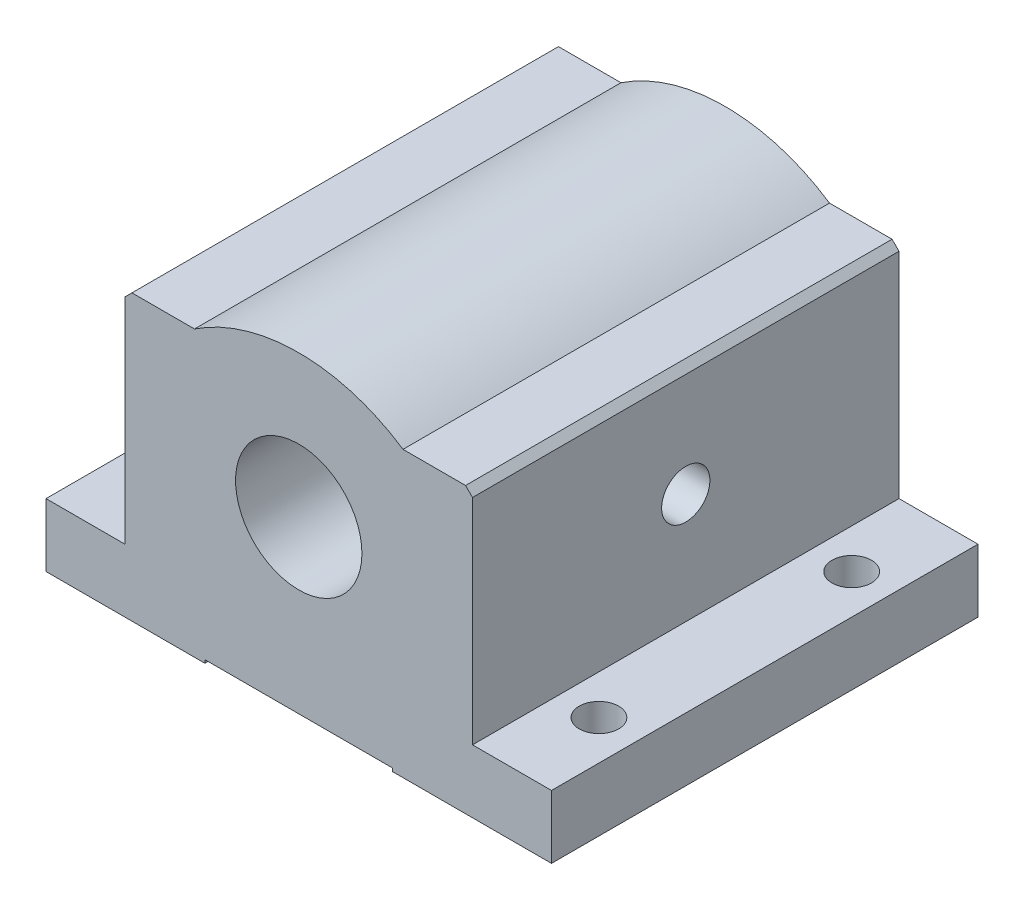
ISO-10303-21;
HEADER;
FILE_DESCRIPTION(('STEP AP214'),'2;1');
FILE_NAME('part.step','',(''),(''),'','','');
FILE_SCHEMA(('AUTOMOTIVE_DESIGN { 1 0 10303 214 1 1 1 1 }'));
ENDSEC;
DATA;
#1=APPLICATION_CONTEXT('core data for automotive mechanical design processes');
#2=APPLICATION_PROTOCOL_DEFINITION('international standard','automotive_design',2000,#1);
#3=PRODUCT_CONTEXT('',#1,'mechanical');
#4=PRODUCT('Part','Part','',(#3));
#5=PRODUCT_RELATED_PRODUCT_CATEGORY('part','',(#4));
#6=PRODUCT_DEFINITION_FORMATION('','',#4);
#7=PRODUCT_DEFINITION_CONTEXT('part definition',#1,'design');
#8=PRODUCT_DEFINITION('design','',#6,#7);
#9=PRODUCT_DEFINITION_SHAPE('','',#8);
#10=(LENGTH_UNIT() NAMED_UNIT(*) SI_UNIT(.MILLI.,.METRE.));
#11=(NAMED_UNIT(*) PLANE_ANGLE_UNIT() SI_UNIT($,.RADIAN.));
#12=(NAMED_UNIT(*) SI_UNIT($,.STERADIAN.) SOLID_ANGLE_UNIT());
#13=UNCERTAINTY_MEASURE_WITH_UNIT(LENGTH_MEASURE(1.E-05),#10,'distance_accuracy_value','');
#14=(GEOMETRIC_REPRESENTATION_CONTEXT(3) GLOBAL_UNCERTAINTY_ASSIGNED_CONTEXT((#13)) GLOBAL_UNIT_ASSIGNED_CONTEXT((#10,
#11,#12)) REPRESENTATION_CONTEXT('',''));
#15=CARTESIAN_POINT('',(0.,0.,0.));
#16=DIRECTION('',(0.,0.,1.));
#17=DIRECTION('',(1.,0.,0.));
#18=AXIS2_PLACEMENT_3D('',#15,#16,#17);
#19=CARTESIAN_POINT('',(0.,-3.000375,21.43125));
#20=DIRECTION('',(0.,0.,-1.));
#21=DIRECTION('',(-1.,0.,0.));
#22=AXIS2_PLACEMENT_3D('',#19,#20,#21);
#23=PLANE('',#22);
#24=DIRECTION('',(-1.,0.,0.));
#25=VECTOR('',#24,1.);
#26=CARTESIAN_POINT('',(-17.4625,12.7,21.43125));
#27=LINE('',#26,#25);
#28=CARTESIAN_POINT('',(-10.4775,12.7,21.43125));
#29=VERTEX_POINT('',#28);
#30=CARTESIAN_POINT('',(-16.764,12.7,21.43125));
#31=VERTEX_POINT('',#30);
#32=EDGE_CURVE('E290',#29,#31,#27,.T.);
#33=ORIENTED_EDGE('',*,*,#32,.T.);
#34=DIRECTION('',(0.707106781186548,0.707106781186548,0.));
#35=VECTOR('',#34,1.);
#36=CARTESIAN_POINT('',(-17.4625,12.0015,21.43125));
#37=LINE('',#36,#35);
#38=CARTESIAN_POINT('',(-17.4625,12.0015,21.43125));
#39=VERTEX_POINT('',#38);
#40=EDGE_CURVE('E192',#31,#39,#37,.F.);
#41=ORIENTED_EDGE('',*,*,#40,.T.);
#42=DIRECTION('',(0.,-1.,0.));
#43=VECTOR('',#42,1.);
#44=CARTESIAN_POINT('',(-17.4625,-9.525,21.43125));
#45=LINE('',#44,#43);
#46=CARTESIAN_POINT('',(-17.4625,-9.525,21.43125));
#47=VERTEX_POINT('',#46);
#48=EDGE_CURVE('E292',#39,#47,#45,.T.);
#49=ORIENTED_EDGE('',*,*,#48,.T.);
#50=DIRECTION('',(-1.,0.,0.));
#51=VECTOR('',#50,1.);
#52=CARTESIAN_POINT('',(-25.4,-9.525,21.43125));
#53=LINE('',#52,#51);
#54=CARTESIAN_POINT('',(-25.4,-9.525,21.43125));
#55=VERTEX_POINT('',#54);
#56=EDGE_CURVE('E168',#47,#55,#53,.T.);
#57=ORIENTED_EDGE('',*,*,#56,.T.);
#58=DIRECTION('',(0.,-1.,0.));
#59=VECTOR('',#58,1.);
#60=CARTESIAN_POINT('',(-25.4,-9.525,21.43125));
#61=LINE('',#60,#59);
#62=CARTESIAN_POINT('',(-25.4,-15.875,21.43125));
#63=VERTEX_POINT('',#62);
#64=EDGE_CURVE('E162',#55,#63,#61,.T.);
#65=ORIENTED_EDGE('',*,*,#64,.T.);
#66=DIRECTION('',(1.,0.,0.));
#67=VECTOR('',#66,1.);
#68=CARTESIAN_POINT('',(-25.4,-15.875,21.43125));
#69=LINE('',#68,#67);
#70=CARTESIAN_POINT('',(-9.42975,-15.875,21.43125));
#71=VERTEX_POINT('',#70);
#72=EDGE_CURVE('E152',#63,#71,#69,.T.);
#73=ORIENTED_EDGE('',*,*,#72,.T.);
#74=DIRECTION('',(0.,1.,0.));
#75=VECTOR('',#74,1.);
#76=CARTESIAN_POINT('',(-9.42975,-15.875,21.43125));
#77=LINE('',#76,#75);
#78=CARTESIAN_POINT('',(-9.42975,-15.5575,21.43125));
#79=VERTEX_POINT('',#78);
#80=EDGE_CURVE('E161',#71,#79,#77,.T.);
#81=ORIENTED_EDGE('',*,*,#80,.T.);
#82=DIRECTION('',(1.,0.,0.));
#83=VECTOR('',#82,1.);
#84=CARTESIAN_POINT('',(-9.42975,-15.5575,21.43125));
#85=LINE('',#84,#83);
#86=CARTESIAN_POINT('',(9.42975,-15.5575,21.43125));
#87=VERTEX_POINT('',#86);
#88=EDGE_CURVE('E256',#79,#87,#85,.T.);
#89=ORIENTED_EDGE('',*,*,#88,.T.);
#90=DIRECTION('',(0.,-1.,0.));
#91=VECTOR('',#90,1.);
#92=CARTESIAN_POINT('',(9.42975,-15.5575,21.43125));
#93=LINE('',#92,#91);
#94=CARTESIAN_POINT('',(9.42975,-15.875,21.43125));
#95=VERTEX_POINT('',#94);
#96=EDGE_CURVE('E298',#87,#95,#93,.T.);
#97=ORIENTED_EDGE('',*,*,#96,.T.);
#98=DIRECTION('',(1.,0.,0.));
#99=VECTOR('',#98,1.);
#100=CARTESIAN_POINT('',(9.42975,-15.875,21.43125));
#101=LINE('',#100,#99);
#102=CARTESIAN_POINT('',(25.4,-15.875,21.43125));
#103=VERTEX_POINT('',#102);
#104=EDGE_CURVE('E302',#95,#103,#101,.T.);
#105=ORIENTED_EDGE('',*,*,#104,.T.);
#106=DIRECTION('',(0.,1.,0.));
#107=VECTOR('',#106,1.);
#108=CARTESIAN_POINT('',(25.4,-9.525,21.43125));
#109=LINE('',#108,#107);
#110=CARTESIAN_POINT('',(25.4,-9.525,21.43125));
#111=VERTEX_POINT('',#110);
#112=EDGE_CURVE('E285',#103,#111,#109,.T.);
#113=ORIENTED_EDGE('',*,*,#112,.T.);
#114=DIRECTION('',(-1.,0.,0.));
#115=VECTOR('',#114,1.);
#116=CARTESIAN_POINT('',(17.4625,-9.525,21.43125));
#117=LINE('',#116,#115);
#118=CARTESIAN_POINT('',(17.4625,-9.525,21.43125));
#119=VERTEX_POINT('',#118);
#120=EDGE_CURVE('E281',#111,#119,#117,.T.);
#121=ORIENTED_EDGE('',*,*,#120,.T.);
#122=DIRECTION('',(0.,1.,0.));
#123=VECTOR('',#122,1.);
#124=CARTESIAN_POINT('',(17.4625,12.7,21.43125));
#125=LINE('',#124,#123);
#126=CARTESIAN_POINT('',(17.4625,12.0015,21.43125));
#127=VERTEX_POINT('',#126);
#128=EDGE_CURVE('E280',#119,#127,#125,.T.);
#129=ORIENTED_EDGE('',*,*,#128,.T.);
#130=DIRECTION('',(0.707106781186544,-0.707106781186551,0.));
#131=VECTOR('',#130,1.);
#132=CARTESIAN_POINT('',(16.764,12.7,21.43125));
#133=LINE('',#132,#131);
#134=CARTESIAN_POINT('',(16.764,12.7,21.43125));
#135=VERTEX_POINT('',#134);
#136=EDGE_CURVE('E54',#127,#135,#133,.F.);
#137=ORIENTED_EDGE('',*,*,#136,.T.);
#138=DIRECTION('',(-1.,0.,0.));
#139=VECTOR('',#138,1.);
#140=CARTESIAN_POINT('',(10.4775,12.7,21.43125));
#141=LINE('',#140,#139);
#142=CARTESIAN_POINT('',(10.4775,12.7,21.43125));
#143=VERTEX_POINT('',#142);
#144=EDGE_CURVE('E201',#135,#143,#141,.T.);
#145=ORIENTED_EDGE('',*,*,#144,.T.);
#146=CARTESIAN_POINT('',(0.,-3.000375,21.43125));
#147=DIRECTION('',(0.,0.,1.));
#148=DIRECTION('',(-1.,0.,0.));
#149=AXIS2_PLACEMENT_3D('',#146,#147,#148);
#150=CIRCLE('',#149,18.875375);
#151=EDGE_CURVE('E283',#143,#29,#150,.T.);
#152=ORIENTED_EDGE('',*,*,#151,.T.);
#153=EDGE_LOOP('',(#33,#41,#49,#57,#65,#73,#81,#89,#97,#105,#113,#121,#129,#137,#145,#152));
#154=FACE_BOUND('',#153,.T.);
#155=CARTESIAN_POINT('',(0.,1.5748,21.43125));
#156=DIRECTION('',(0.,0.,1.));
#157=DIRECTION('',(1.,0.,0.));
#158=AXIS2_PLACEMENT_3D('',#155,#156,#157);
#159=CIRCLE('',#158,6.35);
#160=CARTESIAN_POINT('',(6.35,1.5748,21.43125));
#161=VERTEX_POINT('',#160);
#162=EDGE_CURVE('E295',#161,#161,#159,.T.);
#163=ORIENTED_EDGE('',*,*,#162,.F.);
#164=EDGE_LOOP('',(#163));
#165=FACE_BOUND('',#164,.T.);
#166=ADVANCED_FACE('F39',(#154,#165),#23,.F.);
#167=CARTESIAN_POINT('',(0.,-3.000375,-21.43125));
#168=DIRECTION('',(0.,0.,-1.));
#169=DIRECTION('',(-1.,0.,0.));
#170=AXIS2_PLACEMENT_3D('',#167,#168,#169);
#171=PLANE('',#170);
#172=DIRECTION('',(0.,-1.,0.));
#173=VECTOR('',#172,1.);
#174=CARTESIAN_POINT('',(-17.4625,-9.525,-21.43125));
#175=LINE('',#174,#173);
#176=CARTESIAN_POINT('',(-17.4625,12.0015,-21.43125));
#177=VERTEX_POINT('',#176);
#178=CARTESIAN_POINT('',(-17.4625,-9.525,-21.43125));
#179=VERTEX_POINT('',#178);
#180=EDGE_CURVE('E221',#177,#179,#175,.T.);
#181=ORIENTED_EDGE('',*,*,#180,.F.);
#182=DIRECTION('',(-0.707106781186548,-0.707106781186548,0.));
#183=VECTOR('',#182,1.);
#184=CARTESIAN_POINT('',(-16.2321875,13.2318125,-21.43125));
#185=LINE('',#184,#183);
#186=CARTESIAN_POINT('',(-16.764,12.7,-21.43125));
#187=VERTEX_POINT('',#186);
#188=EDGE_CURVE('E187',#177,#187,#185,.F.);
#189=ORIENTED_EDGE('',*,*,#188,.T.);
#190=DIRECTION('',(-1.,0.,0.));
#191=VECTOR('',#190,1.);
#192=CARTESIAN_POINT('',(-17.4625,12.7,-21.43125));
#193=LINE('',#192,#191);
#194=CARTESIAN_POINT('',(-10.4775,12.7,-21.43125));
#195=VERTEX_POINT('',#194);
#196=EDGE_CURVE('E213',#195,#187,#193,.T.);
#197=ORIENTED_EDGE('',*,*,#196,.F.);
#198=CARTESIAN_POINT('',(0.,-3.000375,-21.43125));
#199=DIRECTION('',(0.,0.,1.));
#200=DIRECTION('',(-1.,0.,0.));
#201=AXIS2_PLACEMENT_3D('',#198,#199,#200);
#202=CIRCLE('',#201,18.875375);
#203=CARTESIAN_POINT('',(10.4775,12.7,-21.43125));
#204=VERTEX_POINT('',#203);
#205=EDGE_CURVE('E210',#204,#195,#202,.T.);
#206=ORIENTED_EDGE('',*,*,#205,.F.);
#207=DIRECTION('',(-1.,0.,0.));
#208=VECTOR('',#207,1.);
#209=CARTESIAN_POINT('',(10.4775,12.7,-21.43125));
#210=LINE('',#209,#208);
#211=CARTESIAN_POINT('',(16.764,12.7,-21.43125));
#212=VERTEX_POINT('',#211);
#213=EDGE_CURVE('E199',#212,#204,#210,.T.);
#214=ORIENTED_EDGE('',*,*,#213,.F.);
#215=DIRECTION('',(-0.707106781186544,0.707106781186551,0.));
#216=VECTOR('',#215,1.);
#217=CARTESIAN_POINT('',(16.2321875000001,13.2318124999999,-21.43125));
#218=LINE('',#217,#216);
#219=CARTESIAN_POINT('',(17.4625,12.0015,-21.43125));
#220=VERTEX_POINT('',#219);
#221=EDGE_CURVE('E180',#212,#220,#218,.F.);
#222=ORIENTED_EDGE('',*,*,#221,.T.);
#223=DIRECTION('',(0.,1.,0.));
#224=VECTOR('',#223,1.);
#225=CARTESIAN_POINT('',(17.4625,12.7,-21.43125));
#226=LINE('',#225,#224);
#227=CARTESIAN_POINT('',(17.4625,-9.525,-21.43125));
#228=VERTEX_POINT('',#227);
#229=EDGE_CURVE('E211',#228,#220,#226,.T.);
#230=ORIENTED_EDGE('',*,*,#229,.F.);
#231=DIRECTION('',(-1.,0.,0.));
#232=VECTOR('',#231,1.);
#233=CARTESIAN_POINT('',(17.4625,-9.525,-21.43125));
#234=LINE('',#233,#232);
#235=CARTESIAN_POINT('',(25.4,-9.525,-21.43125));
#236=VERTEX_POINT('',#235);
#237=EDGE_CURVE('E215',#236,#228,#234,.T.);
#238=ORIENTED_EDGE('',*,*,#237,.F.);
#239=DIRECTION('',(0.,1.,0.));
#240=VECTOR('',#239,1.);
#241=CARTESIAN_POINT('',(25.4,-9.525,-21.43125));
#242=LINE('',#241,#240);
#243=CARTESIAN_POINT('',(25.4,-15.875,-21.43125));
#244=VERTEX_POINT('',#243);
#245=EDGE_CURVE('E271',#244,#236,#242,.T.);
#246=ORIENTED_EDGE('',*,*,#245,.F.);
#247=DIRECTION('',(1.,0.,0.));
#248=VECTOR('',#247,1.);
#249=CARTESIAN_POINT('',(9.42975,-15.875,-21.43125));
#250=LINE('',#249,#248);
#251=CARTESIAN_POINT('',(9.42975,-15.875,-21.43125));
#252=VERTEX_POINT('',#251);
#253=EDGE_CURVE('E264',#252,#244,#250,.T.);
#254=ORIENTED_EDGE('',*,*,#253,.F.);
#255=DIRECTION('',(0.,-1.,0.));
#256=VECTOR('',#255,1.);
#257=CARTESIAN_POINT('',(9.42975,-15.5575,-21.43125));
#258=LINE('',#257,#256);
#259=CARTESIAN_POINT('',(9.42975,-15.5575,-21.43125));
#260=VERTEX_POINT('',#259);
#261=EDGE_CURVE('E262',#260,#252,#258,.T.);
#262=ORIENTED_EDGE('',*,*,#261,.F.);
#263=DIRECTION('',(1.,0.,0.));
#264=VECTOR('',#263,1.);
#265=CARTESIAN_POINT('',(-9.42975,-15.5575,-21.43125));
#266=LINE('',#265,#264);
#267=CARTESIAN_POINT('',(-9.42975,-15.5575,-21.43125));
#268=VERTEX_POINT('',#267);
#269=EDGE_CURVE('E255',#268,#260,#266,.T.);
#270=ORIENTED_EDGE('',*,*,#269,.F.);
#271=DIRECTION('',(0.,1.,0.));
#272=VECTOR('',#271,1.);
#273=CARTESIAN_POINT('',(-9.42975,-15.875,-21.43125));
#274=LINE('',#273,#272);
#275=CARTESIAN_POINT('',(-9.42975,-15.875,-21.43125));
#276=VERTEX_POINT('',#275);
#277=EDGE_CURVE('E260',#276,#268,#274,.T.);
#278=ORIENTED_EDGE('',*,*,#277,.F.);
#279=DIRECTION('',(1.,0.,0.));
#280=VECTOR('',#279,1.);
#281=CARTESIAN_POINT('',(-25.4,-15.875,-21.43125));
#282=LINE('',#281,#280);
#283=CARTESIAN_POINT('',(-25.4,-15.875,-21.43125));
#284=VERTEX_POINT('',#283);
#285=EDGE_CURVE('E266',#284,#276,#282,.T.);
#286=ORIENTED_EDGE('',*,*,#285,.F.);
#287=DIRECTION('',(0.,-1.,0.));
#288=VECTOR('',#287,1.);
#289=CARTESIAN_POINT('',(-25.4,-9.525,-21.43125));
#290=LINE('',#289,#288);
#291=CARTESIAN_POINT('',(-25.4,-9.525,-21.43125));
#292=VERTEX_POINT('',#291);
#293=EDGE_CURVE('E176',#292,#284,#290,.T.);
#294=ORIENTED_EDGE('',*,*,#293,.F.);
#295=DIRECTION('',(-1.,0.,0.));
#296=VECTOR('',#295,1.);
#297=CARTESIAN_POINT('',(-25.4,-9.525,-21.43125));
#298=LINE('',#297,#296);
#299=EDGE_CURVE('E172',#179,#292,#298,.T.);
#300=ORIENTED_EDGE('',*,*,#299,.F.);
#301=EDGE_LOOP('',(#181,#189,#197,#206,#214,#222,#230,#238,#246,#254,#262,#270,#278,#286,#294,#300));
#302=FACE_BOUND('',#301,.T.);
#303=CARTESIAN_POINT('',(0.,1.5748,-21.43125));
#304=DIRECTION('',(0.,0.,1.));
#305=DIRECTION('',(1.,0.,0.));
#306=AXIS2_PLACEMENT_3D('',#303,#304,#305);
#307=CIRCLE('',#306,6.35);
#308=CARTESIAN_POINT('',(6.35,1.5748,-21.43125));
#309=VERTEX_POINT('',#308);
#310=EDGE_CURVE('E539',#309,#309,#307,.T.);
#311=ORIENTED_EDGE('',*,*,#310,.T.);
#312=EDGE_LOOP('',(#311));
#313=FACE_BOUND('',#312,.T.);
#314=ADVANCED_FACE('F206',(#302,#313),#171,.T.);
#315=CARTESIAN_POINT('',(-25.4,-9.525,21.43125));
#316=DIRECTION('',(1.,0.,0.));
#317=DIRECTION('',(0.,1.,0.));
#318=AXIS2_PLACEMENT_3D('',#315,#316,#317);
#319=PLANE('',#318);
#320=ORIENTED_EDGE('',*,*,#293,.T.);
#321=DIRECTION('',(0.,0.,-1.));
#322=VECTOR('',#321,1.);
#323=CARTESIAN_POINT('',(-25.4,-15.875,21.43125));
#324=LINE('',#323,#322);
#325=EDGE_CURVE('E156',#63,#284,#324,.T.);
#326=ORIENTED_EDGE('',*,*,#325,.F.);
#327=ORIENTED_EDGE('',*,*,#64,.F.);
#328=DIRECTION('',(0.,0.,-1.));
#329=VECTOR('',#328,1.);
#330=CARTESIAN_POINT('',(-25.4,-9.525,21.43125));
#331=LINE('',#330,#329);
#332=EDGE_CURVE('E224',#55,#292,#331,.T.);
#333=ORIENTED_EDGE('',*,*,#332,.T.);
#334=EDGE_LOOP('',(#320,#326,#327,#333));
#335=FACE_BOUND('',#334,.T.);
#336=ADVANCED_FACE('F174',(#335),#319,.F.);
#337=CARTESIAN_POINT('',(-25.4,-15.875,21.43125));
#338=DIRECTION('',(0.,1.,0.));
#339=DIRECTION('',(0.,0.,1.));
#340=AXIS2_PLACEMENT_3D('',#337,#338,#339);
#341=PLANE('',#340);
#342=CARTESIAN_POINT('',(-21.4376,-15.875,12.7));
#343=DIRECTION('',(0.,1.,0.));
#344=DIRECTION('',(-1.,0.,0.));
#345=AXIS2_PLACEMENT_3D('',#342,#343,#344);
#346=CIRCLE('',#345,1.984375);
#347=CARTESIAN_POINT('',(-23.421975,-15.875,12.7));
#348=VERTEX_POINT('',#347);
#349=EDGE_CURVE('E553',#348,#348,#346,.T.);
#350=ORIENTED_EDGE('',*,*,#349,.T.);
#351=EDGE_LOOP('',(#350));
#352=FACE_BOUND('',#351,.T.);
#353=CARTESIAN_POINT('',(-21.4376,-15.875,-12.7));
#354=DIRECTION('',(0.,1.,0.));
#355=DIRECTION('',(-1.,0.,0.));
#356=AXIS2_PLACEMENT_3D('',#353,#354,#355);
#357=CIRCLE('',#356,1.984375);
#358=CARTESIAN_POINT('',(-23.421975,-15.875,-12.7));
#359=VERTEX_POINT('',#358);
#360=EDGE_CURVE('E540',#359,#359,#357,.T.);
#361=ORIENTED_EDGE('',*,*,#360,.T.);
#362=EDGE_LOOP('',(#361));
#363=FACE_BOUND('',#362,.T.);
#364=ORIENTED_EDGE('',*,*,#285,.T.);
#365=DIRECTION('',(0.,0.,-1.));
#366=VECTOR('',#365,1.);
#367=CARTESIAN_POINT('',(-9.42975,-15.875,21.43125));
#368=LINE('',#367,#366);
#369=EDGE_CURVE('E159',#71,#276,#368,.T.);
#370=ORIENTED_EDGE('',*,*,#369,.F.);
#371=ORIENTED_EDGE('',*,*,#72,.F.);
#372=ORIENTED_EDGE('',*,*,#325,.T.);
#373=EDGE_LOOP('',(#364,#370,#371,#372));
#374=FACE_BOUND('',#373,.T.);
#375=ADVANCED_FACE('F154',(#352,#363,#374),#341,.F.);
#376=CARTESIAN_POINT('',(-9.42975,-15.875,21.43125));
#377=DIRECTION('',(-1.,0.,0.));
#378=DIRECTION('',(0.,-1.,0.));
#379=AXIS2_PLACEMENT_3D('',#376,#377,#378);
#380=PLANE('',#379);
#381=ORIENTED_EDGE('',*,*,#277,.T.);
#382=DIRECTION('',(0.,0.,-1.));
#383=VECTOR('',#382,1.);
#384=CARTESIAN_POINT('',(-9.42975,-15.5575,21.43125));
#385=LINE('',#384,#383);
#386=EDGE_CURVE('E182',#79,#268,#385,.T.);
#387=ORIENTED_EDGE('',*,*,#386,.F.);
#388=ORIENTED_EDGE('',*,*,#80,.F.);
#389=ORIENTED_EDGE('',*,*,#369,.T.);
#390=EDGE_LOOP('',(#381,#387,#388,#389));
#391=FACE_BOUND('',#390,.T.);
#392=ADVANCED_FACE('F296',(#391),#380,.F.);
#393=CARTESIAN_POINT('',(-9.42975,-15.5575,21.43125));
#394=DIRECTION('',(0.,1.,0.));
#395=DIRECTION('',(0.,0.,1.));
#396=AXIS2_PLACEMENT_3D('',#393,#394,#395);
#397=PLANE('',#396);
#398=ORIENTED_EDGE('',*,*,#269,.T.);
#399=DIRECTION('',(0.,0.,-1.));
#400=VECTOR('',#399,1.);
#401=CARTESIAN_POINT('',(9.42975,-15.5575,21.43125));
#402=LINE('',#401,#400);
#403=EDGE_CURVE('E246',#87,#260,#402,.T.);
#404=ORIENTED_EDGE('',*,*,#403,.F.);
#405=ORIENTED_EDGE('',*,*,#88,.F.);
#406=ORIENTED_EDGE('',*,*,#386,.T.);
#407=EDGE_LOOP('',(#398,#404,#405,#406));
#408=FACE_BOUND('',#407,.T.);
#409=ADVANCED_FACE('F253',(#408),#397,.F.);
#410=CARTESIAN_POINT('',(9.42975,-15.5575,21.43125));
#411=DIRECTION('',(1.,0.,0.));
#412=DIRECTION('',(0.,1.,0.));
#413=AXIS2_PLACEMENT_3D('',#410,#411,#412);
#414=PLANE('',#413);
#415=ORIENTED_EDGE('',*,*,#261,.T.);
#416=DIRECTION('',(0.,0.,-1.));
#417=VECTOR('',#416,1.);
#418=CARTESIAN_POINT('',(9.42975,-15.875,21.43125));
#419=LINE('',#418,#417);
#420=EDGE_CURVE('E243',#95,#252,#419,.T.);
#421=ORIENTED_EDGE('',*,*,#420,.F.);
#422=ORIENTED_EDGE('',*,*,#96,.F.);
#423=ORIENTED_EDGE('',*,*,#403,.T.);
#424=EDGE_LOOP('',(#415,#421,#422,#423));
#425=FACE_BOUND('',#424,.T.);
#426=ADVANCED_FACE('F313',(#425),#414,.F.);
#427=CARTESIAN_POINT('',(9.42975,-15.875,21.43125));
#428=DIRECTION('',(0.,1.,0.));
#429=DIRECTION('',(0.,0.,1.));
#430=AXIS2_PLACEMENT_3D('',#427,#428,#429);
#431=PLANE('',#430);
#432=CARTESIAN_POINT('',(21.4376,-15.875,12.7));
#433=DIRECTION('',(0.,1.,0.));
#434=DIRECTION('',(-1.,0.,0.));
#435=AXIS2_PLACEMENT_3D('',#432,#433,#434);
#436=CIRCLE('',#435,1.984375);
#437=CARTESIAN_POINT('',(19.453225,-15.875,12.7));
#438=VERTEX_POINT('',#437);
#439=EDGE_CURVE('E560',#438,#438,#436,.T.);
#440=ORIENTED_EDGE('',*,*,#439,.T.);
#441=EDGE_LOOP('',(#440));
#442=FACE_BOUND('',#441,.T.);
#443=CARTESIAN_POINT('',(21.4376,-15.875,-12.7));
#444=DIRECTION('',(0.,1.,0.));
#445=DIRECTION('',(-1.,0.,0.));
#446=AXIS2_PLACEMENT_3D('',#443,#444,#445);
#447=CIRCLE('',#446,1.984375);
#448=CARTESIAN_POINT('',(19.453225,-15.875,-12.7));
#449=VERTEX_POINT('',#448);
#450=EDGE_CURVE('E548',#449,#449,#447,.T.);
#451=ORIENTED_EDGE('',*,*,#450,.T.);
#452=EDGE_LOOP('',(#451));
#453=FACE_BOUND('',#452,.T.);
#454=ORIENTED_EDGE('',*,*,#253,.T.);
#455=DIRECTION('',(0.,0.,-1.));
#456=VECTOR('',#455,1.);
#457=CARTESIAN_POINT('',(25.4,-15.875,21.43125));
#458=LINE('',#457,#456);
#459=EDGE_CURVE('E240',#103,#244,#458,.T.);
#460=ORIENTED_EDGE('',*,*,#459,.F.);
#461=ORIENTED_EDGE('',*,*,#104,.F.);
#462=ORIENTED_EDGE('',*,*,#420,.T.);
#463=EDGE_LOOP('',(#454,#460,#461,#462));
#464=FACE_BOUND('',#463,.T.);
#465=ADVANCED_FACE('F309',(#442,#453,#464),#431,.F.);
#466=CARTESIAN_POINT('',(25.4,-9.525,21.43125));
#467=DIRECTION('',(-1.,0.,0.));
#468=DIRECTION('',(0.,-1.,0.));
#469=AXIS2_PLACEMENT_3D('',#466,#467,#468);
#470=PLANE('',#469);
#471=ORIENTED_EDGE('',*,*,#245,.T.);
#472=DIRECTION('',(0.,0.,-1.));
#473=VECTOR('',#472,1.);
#474=CARTESIAN_POINT('',(25.4,-9.525,21.43125));
#475=LINE('',#474,#473);
#476=EDGE_CURVE('E237',#111,#236,#475,.T.);
#477=ORIENTED_EDGE('',*,*,#476,.F.);
#478=ORIENTED_EDGE('',*,*,#112,.F.);
#479=ORIENTED_EDGE('',*,*,#459,.T.);
#480=EDGE_LOOP('',(#471,#477,#478,#479));
#481=FACE_BOUND('',#480,.T.);
#482=ADVANCED_FACE('F307',(#481),#470,.F.);
#483=CARTESIAN_POINT('',(17.4625,-9.525,21.43125));
#484=DIRECTION('',(0.,-1.,0.));
#485=DIRECTION('',(0.,0.,-1.));
#486=AXIS2_PLACEMENT_3D('',#483,#484,#485);
#487=PLANE('',#486);
#488=CARTESIAN_POINT('',(21.4376,-9.52499999999999,12.7));
#489=DIRECTION('',(0.,1.,0.));
#490=DIRECTION('',(-1.,0.,0.));
#491=AXIS2_PLACEMENT_3D('',#488,#489,#490);
#492=CIRCLE('',#491,1.984375);
#493=CARTESIAN_POINT('',(19.453225,-9.52499999999999,12.7));
#494=VERTEX_POINT('',#493);
#495=EDGE_CURVE('E557',#494,#494,#492,.T.);
#496=ORIENTED_EDGE('',*,*,#495,.F.);
#497=EDGE_LOOP('',(#496));
#498=FACE_BOUND('',#497,.T.);
#499=CARTESIAN_POINT('',(21.4376,-9.52499999999999,-12.7));
#500=DIRECTION('',(0.,1.,0.));
#501=DIRECTION('',(-1.,0.,0.));
#502=AXIS2_PLACEMENT_3D('',#499,#500,#501);
#503=CIRCLE('',#502,1.984375);
#504=CARTESIAN_POINT('',(19.453225,-9.52499999999999,-12.7));
#505=VERTEX_POINT('',#504);
#506=EDGE_CURVE('E563',#505,#505,#503,.T.);
#507=ORIENTED_EDGE('',*,*,#506,.F.);
#508=EDGE_LOOP('',(#507));
#509=FACE_BOUND('',#508,.T.);
#510=ORIENTED_EDGE('',*,*,#237,.T.);
#511=DIRECTION('',(0.,0.,-1.));
#512=VECTOR('',#511,1.);
#513=CARTESIAN_POINT('',(17.4625,-9.525,21.43125));
#514=LINE('',#513,#512);
#515=EDGE_CURVE('E234',#119,#228,#514,.T.);
#516=ORIENTED_EDGE('',*,*,#515,.F.);
#517=ORIENTED_EDGE('',*,*,#120,.F.);
#518=ORIENTED_EDGE('',*,*,#476,.T.);
#519=EDGE_LOOP('',(#510,#516,#517,#518));
#520=FACE_BOUND('',#519,.T.);
#521=ADVANCED_FACE('F275',(#498,#509,#520),#487,.F.);
#522=CARTESIAN_POINT('',(17.4625,12.7,21.43125));
#523=DIRECTION('',(-1.,0.,0.));
#524=DIRECTION('',(0.,0.,1.));
#525=AXIS2_PLACEMENT_3D('',#522,#523,#524);
#526=PLANE('',#525);
#527=CARTESIAN_POINT('',(17.4625,1.5748,0.));
#528=DIRECTION('',(1.,0.,0.));
#529=DIRECTION('',(0.,0.,-1.));
#530=AXIS2_PLACEMENT_3D('',#527,#528,#529);
#531=CIRCLE('',#530,2.4257);
#532=CARTESIAN_POINT('',(17.4625,1.5748,-2.4257));
#533=VERTEX_POINT('',#532);
#534=EDGE_CURVE('E554',#533,#533,#531,.T.);
#535=ORIENTED_EDGE('',*,*,#534,.F.);
#536=EDGE_LOOP('',(#535));
#537=FACE_BOUND('',#536,.T.);
#538=ORIENTED_EDGE('',*,*,#229,.T.);
#539=DIRECTION('',(0.,0.,1.));
#540=VECTOR('',#539,1.);
#541=CARTESIAN_POINT('',(17.4625,12.0015,21.43125));
#542=LINE('',#541,#540);
#543=EDGE_CURVE('E11',#220,#127,#542,.T.);
#544=ORIENTED_EDGE('',*,*,#543,.T.);
#545=ORIENTED_EDGE('',*,*,#128,.F.);
#546=ORIENTED_EDGE('',*,*,#515,.T.);
#547=EDGE_LOOP('',(#538,#544,#545,#546));
#548=FACE_BOUND('',#547,.T.);
#549=ADVANCED_FACE('F279',(#537,#548),#526,.F.);
#550=CARTESIAN_POINT('',(10.4775,12.7,21.43125));
#551=DIRECTION('',(0.,-1.,0.));
#552=DIRECTION('',(1.,0.,0.));
#553=AXIS2_PLACEMENT_3D('',#550,#551,#552);
#554=PLANE('',#553);
#555=ORIENTED_EDGE('',*,*,#144,.F.);
#556=DIRECTION('',(0.,0.,-1.));
#557=VECTOR('',#556,1.);
#558=CARTESIAN_POINT('',(16.764,12.7,21.43125));
#559=LINE('',#558,#557);
#560=EDGE_CURVE('E47',#135,#212,#559,.T.);
#561=ORIENTED_EDGE('',*,*,#560,.T.);
#562=ORIENTED_EDGE('',*,*,#213,.T.);
#563=DIRECTION('',(0.,0.,-1.));
#564=VECTOR('',#563,1.);
#565=CARTESIAN_POINT('',(10.4775,12.7,21.43125));
#566=LINE('',#565,#564);
#567=EDGE_CURVE('E232',#143,#204,#566,.T.);
#568=ORIENTED_EDGE('',*,*,#567,.F.);
#569=EDGE_LOOP('',(#555,#561,#562,#568));
#570=FACE_BOUND('',#569,.T.);
#571=ADVANCED_FACE('F197',(#570),#554,.F.);
#572=CARTESIAN_POINT('',(0.,-3.000375,21.43125));
#573=DIRECTION('',(0.,0.,-1.));
#574=DIRECTION('',(-1.,0.,0.));
#575=AXIS2_PLACEMENT_3D('',#572,#573,#574);
#576=CYLINDRICAL_SURFACE('',#575,18.875375);
#577=ORIENTED_EDGE('',*,*,#205,.T.);
#578=DIRECTION('',(0.,0.,-1.));
#579=VECTOR('',#578,1.);
#580=CARTESIAN_POINT('',(-10.4775,12.7,21.43125));
#581=LINE('',#580,#579);
#582=EDGE_CURVE('E229',#29,#195,#581,.T.);
#583=ORIENTED_EDGE('',*,*,#582,.F.);
#584=ORIENTED_EDGE('',*,*,#151,.F.);
#585=ORIENTED_EDGE('',*,*,#567,.T.);
#586=EDGE_LOOP('',(#577,#583,#584,#585));
#587=FACE_BOUND('',#586,.T.);
#588=ADVANCED_FACE('F346',(#587),#576,.T.);
#589=CARTESIAN_POINT('',(-17.4625,12.7,21.43125));
#590=DIRECTION('',(0.,-1.,0.));
#591=DIRECTION('',(0.,0.,-1.));
#592=AXIS2_PLACEMENT_3D('',#589,#590,#591);
#593=PLANE('',#592);
#594=ORIENTED_EDGE('',*,*,#196,.T.);
#595=DIRECTION('',(0.,0.,1.));
#596=VECTOR('',#595,1.);
#597=CARTESIAN_POINT('',(-16.764,12.7,21.43125));
#598=LINE('',#597,#596);
#599=EDGE_CURVE('E189',#187,#31,#598,.T.);
#600=ORIENTED_EDGE('',*,*,#599,.T.);
#601=ORIENTED_EDGE('',*,*,#32,.F.);
#602=ORIENTED_EDGE('',*,*,#582,.T.);
#603=EDGE_LOOP('',(#594,#600,#601,#602));
#604=FACE_BOUND('',#603,.T.);
#605=ADVANCED_FACE('F342',(#604),#593,.F.);
#606=CARTESIAN_POINT('',(-17.4625,-9.525,21.43125));
#607=DIRECTION('',(1.,0.,0.));
#608=DIRECTION('',(0.,0.,-1.));
#609=AXIS2_PLACEMENT_3D('',#606,#607,#608);
#610=PLANE('',#609);
#611=ORIENTED_EDGE('',*,*,#48,.F.);
#612=DIRECTION('',(0.,0.,-1.));
#613=VECTOR('',#612,1.);
#614=CARTESIAN_POINT('',(-17.4625,12.0015,21.43125));
#615=LINE('',#614,#613);
#616=EDGE_CURVE('E177',#39,#177,#615,.T.);
#617=ORIENTED_EDGE('',*,*,#616,.T.);
#618=ORIENTED_EDGE('',*,*,#180,.T.);
#619=DIRECTION('',(0.,0.,-1.));
#620=VECTOR('',#619,1.);
#621=CARTESIAN_POINT('',(-17.4625,-9.525,21.43125));
#622=LINE('',#621,#620);
#623=EDGE_CURVE('E226',#47,#179,#622,.T.);
#624=ORIENTED_EDGE('',*,*,#623,.F.);
#625=EDGE_LOOP('',(#611,#617,#618,#624));
#626=FACE_BOUND('',#625,.T.);
#627=ADVANCED_FACE('F338',(#626),#610,.F.);
#628=CARTESIAN_POINT('',(-25.4,-9.525,21.43125));
#629=DIRECTION('',(0.,-1.,0.));
#630=DIRECTION('',(0.,0.,-1.));
#631=AXIS2_PLACEMENT_3D('',#628,#629,#630);
#632=PLANE('',#631);
#633=CARTESIAN_POINT('',(-21.4376,-9.52500000000001,12.7));
#634=DIRECTION('',(0.,1.,0.));
#635=DIRECTION('',(-1.,0.,0.));
#636=AXIS2_PLACEMENT_3D('',#633,#634,#635);
#637=CIRCLE('',#636,1.984375);
#638=CARTESIAN_POINT('',(-23.421975,-9.52500000000001,12.7));
#639=VERTEX_POINT('',#638);
#640=EDGE_CURVE('E550',#639,#639,#637,.T.);
#641=ORIENTED_EDGE('',*,*,#640,.F.);
#642=EDGE_LOOP('',(#641));
#643=FACE_BOUND('',#642,.T.);
#644=CARTESIAN_POINT('',(-21.4376,-9.52500000000001,-12.7));
#645=DIRECTION('',(0.,1.,0.));
#646=DIRECTION('',(-1.,0.,0.));
#647=AXIS2_PLACEMENT_3D('',#644,#645,#646);
#648=CIRCLE('',#647,1.984375);
#649=CARTESIAN_POINT('',(-23.421975,-9.52500000000001,-12.7));
#650=VERTEX_POINT('',#649);
#651=EDGE_CURVE('E544',#650,#650,#648,.T.);
#652=ORIENTED_EDGE('',*,*,#651,.F.);
#653=EDGE_LOOP('',(#652));
#654=FACE_BOUND('',#653,.T.);
#655=ORIENTED_EDGE('',*,*,#299,.T.);
#656=ORIENTED_EDGE('',*,*,#332,.F.);
#657=ORIENTED_EDGE('',*,*,#56,.F.);
#658=ORIENTED_EDGE('',*,*,#623,.T.);
#659=EDGE_LOOP('',(#655,#656,#657,#658));
#660=FACE_BOUND('',#659,.T.);
#661=ADVANCED_FACE('F335',(#643,#654,#660),#632,.F.);
#662=CARTESIAN_POINT('',(0.,1.5748,21.43125));
#663=DIRECTION('',(0.,0.,-1.));
#664=DIRECTION('',(-1.,0.,0.));
#665=AXIS2_PLACEMENT_3D('',#662,#663,#664);
#666=CYLINDRICAL_SURFACE('',#665,6.35);
#667=CARTESIAN_POINT('',(6.35,1.5748,-2.4257));
#668=CARTESIAN_POINT('',(6.35000421631431,1.70599274551041,-2.42570555521194));
#669=CARTESIAN_POINT('',(6.34589931044017,1.83714819996812,-2.41502379406043));
#670=CARTESIAN_POINT('',(6.329935517371,2.09552997109993,-2.37275967440471));
#671=CARTESIAN_POINT('',(6.31807806456738,2.22275701005781,-2.34118118224148));
#672=CARTESIAN_POINT('',(6.28787907114285,2.46951750661999,-2.25840981210013));
#673=CARTESIAN_POINT('',(6.26955033138459,2.58906560610999,-2.20725564016962));
#674=CARTESIAN_POINT('',(6.22822654882296,2.81787199931401,-2.08698572486297));
#675=CARTESIAN_POINT('',(6.20523020671183,2.92712741545571,-2.01786497867374));
#676=CARTESIAN_POINT('',(6.15581106362065,3.13703547371853,-1.86046340152729));
#677=CARTESIAN_POINT('',(6.12928879366464,3.23717779881787,-1.77153355973088));
#678=CARTESIAN_POINT('',(6.07628696786341,3.42154179768747,-1.57841593577753));
#679=CARTESIAN_POINT('',(6.04980742854711,3.50575832792935,-1.47422324341753));
#680=CARTESIAN_POINT('',(5.99872007851975,3.65918674525849,-1.24848011831898));
#681=CARTESIAN_POINT('',(5.97422884570161,3.72766729004745,-1.12640357777231));
#682=CARTESIAN_POINT('',(5.93144518343018,3.84289707398084,-0.871384215969399));
#683=CARTESIAN_POINT('',(5.91315017257307,3.88965536584343,-0.738445948531984));
#684=CARTESIAN_POINT('',(5.8858969378059,3.95808134371731,-0.47135946889546));
#685=CARTESIAN_POINT('',(5.8765769260379,3.98072555003996,-0.337499626232854));
#686=CARTESIAN_POINT('',(5.86727286533234,4.00333326811575,-0.0675805024579127));
#687=CARTESIAN_POINT('',(5.86728477174923,4.00330660588988,0.0684778002270199));
#688=CARTESIAN_POINT('',(5.87633218941133,3.98131814040922,0.32987758149366));
#689=CARTESIAN_POINT('',(5.88480388831171,3.9607268784408,0.455357529761112));
#690=CARTESIAN_POINT('',(5.90887678386734,3.90046481041337,0.700923456617477));
#691=CARTESIAN_POINT('',(5.92447909595375,3.86079101925196,0.821008588074249));
#692=CARTESIAN_POINT('',(5.96138417885221,3.76276188240352,1.05511336403014));
#693=CARTESIAN_POINT('',(5.98279144049861,3.70405980645752,1.16897061821025));
#694=CARTESIAN_POINT('',(6.02886124271726,3.56988254245214,1.38561000442247));
#695=CARTESIAN_POINT('',(6.05352493522327,3.49440141246055,1.4883881938543));
#696=CARTESIAN_POINT('',(6.10543224581301,3.32259478114449,1.6875156752913));
#697=CARTESIAN_POINT('',(6.13273565112252,3.22518055651733,1.78291239446961));
#698=CARTESIAN_POINT('',(6.18536737879022,3.01542862182652,1.95630466528648));
#699=CARTESIAN_POINT('',(6.21069537384598,2.90308844700828,2.03429733724491));
#700=CARTESIAN_POINT('',(6.25706037735591,2.66416947166273,2.17177172038076));
#701=CARTESIAN_POINT('',(6.2780192461389,2.53738540996384,2.23092494613153));
#702=CARTESIAN_POINT('',(6.31270195607275,2.27466448361193,2.32674357313456));
#703=CARTESIAN_POINT('',(6.32642913643015,2.13873187602488,2.36341935454733));
#704=CARTESIAN_POINT('',(6.34450885840309,1.8695807174398,2.4113846787847));
#705=CARTESIAN_POINT('',(6.34933427157248,1.73662221202633,2.42395623855695));
#706=CARTESIAN_POINT('',(6.350535810538,1.47042257961449,2.42710365185961));
#707=CARTESIAN_POINT('',(6.34691389428935,1.33718152525837,2.41768460245935));
#708=CARTESIAN_POINT('',(6.33193917590064,1.07981304592703,2.37808423076809));
#709=CARTESIAN_POINT('',(6.32090286460192,0.955534547278318,2.34875238730183));
#710=CARTESIAN_POINT('',(6.29253001622816,0.713757726080533,2.27128776363738));
#711=CARTESIAN_POINT('',(6.27519266126104,0.596260286026134,2.22315254265048));
#712=CARTESIAN_POINT('',(6.23527996622341,0.367456170518954,2.10789923041946));
#713=CARTESIAN_POINT('',(6.21256403620282,0.256437990587368,2.04025860087465));
#714=CARTESIAN_POINT('',(6.16439349475184,0.0469500897501281,1.88850197697102));
#715=CARTESIAN_POINT('',(6.13893784784423,-0.051514855722528,1.80437974345809));
#716=CARTESIAN_POINT('',(6.0861801683058,-0.239309944900018,1.61609084607009));
#717=CARTESIAN_POINT('',(6.05885927512005,-0.32773265112169,1.51102204800151));
#718=CARTESIAN_POINT('',(6.00691561256932,-0.485882756311846,1.28701397645735));
#719=CARTESIAN_POINT('',(5.98229313645855,-0.555608124510237,1.16807319831881));
#720=CARTESIAN_POINT('',(5.93860180789185,-0.674548043408546,0.918507336424548));
#721=CARTESIAN_POINT('',(5.91956453433063,-0.723646619210703,0.78782107227078));
#722=CARTESIAN_POINT('',(5.88983689435984,-0.798801952219606,0.519100555749978));
#723=CARTESIAN_POINT('',(5.87914109666732,-0.824873704067855,0.38107114728998));
#724=CARTESIAN_POINT('',(5.86804656810162,-0.85186898800287,0.111456601775613));
#725=CARTESIAN_POINT('',(5.86701125935808,-0.854347436946643,-0.0199478553987599));
#726=CARTESIAN_POINT('',(5.87371303319572,-0.838096871655858,-0.281198080204059));
#727=CARTESIAN_POINT('',(5.88144921689066,-0.819370030500266,-0.411044006172425));
#728=CARTESIAN_POINT('',(5.90428350249591,-0.762468108692281,-0.661146507471499));
#729=CARTESIAN_POINT('',(5.91913122656424,-0.724952611894796,-0.781577998859537));
#730=CARTESIAN_POINT('',(5.95436114361417,-0.632128976076325,-1.01450190742272));
#731=CARTESIAN_POINT('',(5.97474475966397,-0.576816261388206,-1.12699227385431));
#732=CARTESIAN_POINT('',(6.02011389674137,-0.446517636065572,-1.34742680105875));
#733=CARTESIAN_POINT('',(6.04528804360749,-0.370633164663989,-1.45480048545136));
#734=CARTESIAN_POINT('',(6.0967736364053,-0.202714344282901,-1.65578528137022));
#735=CARTESIAN_POINT('',(6.12308544854987,-0.110674765385272,-1.74939191797744));
#736=CARTESIAN_POINT('',(6.17568340015065,0.0932073115263739,-1.92563463013224));
#737=CARTESIAN_POINT('',(6.20188258732078,0.205879545078405,-2.00734124239401));
#738=CARTESIAN_POINT('',(6.24973564081861,0.444279817872966,-2.1506484716273));
#739=CARTESIAN_POINT('',(6.27138885775204,0.570009718581106,-2.21224621673294));
#740=CARTESIAN_POINT('',(6.308756146817,0.838898562026683,-2.3161244099367));
#741=CARTESIAN_POINT('',(6.32404240167236,0.982648765439177,-2.35704435344595));
#742=CARTESIAN_POINT('',(6.34465917714579,1.2758842496816,-2.41182150966065));
#743=CARTESIAN_POINT('',(6.34999519745258,1.42536631574013,-2.42569367239565));
#744=CARTESIAN_POINT('',(6.35,1.5748,-2.4257));
#745=B_SPLINE_CURVE_WITH_KNOTS('',3,(#667,#668,#669,#670,#671,#672,#673,#674,#675,#676,#677,
#678,#679,#680,#681,#682,#683,#684,#685,#686,#687,#688,#689,#690,#691,#692,#693,#694,#695,#696,
#697,#698,#699,#700,#701,#702,#703,#704,#705,#706,#707,#708,#709,#710,#711,#712,#713,#714,#715,
#716,#717,#718,#719,#720,#721,#722,#723,#724,#725,#726,#727,#728,#729,#730,#731,#732,#733,#734,
#735,#736,#737,#738,#739,#740,#741,#742,#743,#744),.UNSPECIFIED.,.T.,.F.,(4,2,2,2,2,2,2,2,2,2,2,
2,2,2,2,2,2,2,2,2,2,2,2,2,2,2,2,2,2,2,2,2,2,2,2,2,2,2,4),(0.,0.39302685623913,0.785981014450803,
1.17816218463775,1.57045267532214,1.97823958923386,2.38615798133579,2.81032571345293,
3.23431651533957,3.64039553726289,4.04629855627086,4.42684205732784,4.80744510662087,
5.19541497675306,5.58352245735817,5.99877763681578,6.41410147368757,6.83631401357312,
7.25833142705789,7.65720273269527,8.05598159556132,8.43873670312419,8.82154151106378,
9.21574427631883,9.61009655739259,10.0282016479122,10.4463521316168,10.86682319619,
11.287020255487,11.6793157577265,12.0715710618855,12.4509312829521,12.8303891156221,
13.2302684768707,13.6302775312561,14.0530873483638,14.4759575230446,14.9238781799902,
15.3715511889847),.UNSPECIFIED.);
#746=CARTESIAN_POINT('',(6.35,1.5748,-2.4257));
#747=VERTEX_POINT('',#746);
#748=EDGE_CURVE('E533',#747,#747,#745,.T.);
#749=ORIENTED_EDGE('',*,*,#748,.T.);
#750=EDGE_LOOP('',(#749));
#751=FACE_BOUND('',#750,.T.);
#752=ORIENTED_EDGE('',*,*,#162,.T.);
#753=EDGE_LOOP('',(#752));
#754=FACE_BOUND('',#753,.T.);
#755=ORIENTED_EDGE('',*,*,#310,.F.);
#756=EDGE_LOOP('',(#755));
#757=FACE_BOUND('',#756,.T.);
#758=ADVANCED_FACE('F332',(#751,#754,#757),#666,.F.);
#759=CARTESIAN_POINT('',(-21.4376,-15.875,-12.7));
#760=DIRECTION('',(0.,1.,0.));
#761=DIRECTION('',(-1.,0.,0.));
#762=AXIS2_PLACEMENT_3D('',#759,#760,#761);
#763=CYLINDRICAL_SURFACE('',#762,1.984375);
#764=ORIENTED_EDGE('',*,*,#360,.F.);
#765=EDGE_LOOP('',(#764));
#766=FACE_BOUND('',#765,.T.);
#767=ORIENTED_EDGE('',*,*,#651,.T.);
#768=EDGE_LOOP('',(#767));
#769=FACE_BOUND('',#768,.T.);
#770=ADVANCED_FACE('F400',(#766,#769),#763,.F.);
#771=CARTESIAN_POINT('',(-21.4376,-15.875,12.7));
#772=DIRECTION('',(0.,1.,0.));
#773=DIRECTION('',(-1.,0.,0.));
#774=AXIS2_PLACEMENT_3D('',#771,#772,#773);
#775=CYLINDRICAL_SURFACE('',#774,1.984375);
#776=ORIENTED_EDGE('',*,*,#349,.F.);
#777=EDGE_LOOP('',(#776));
#778=FACE_BOUND('',#777,.T.);
#779=ORIENTED_EDGE('',*,*,#640,.T.);
#780=EDGE_LOOP('',(#779));
#781=FACE_BOUND('',#780,.T.);
#782=ADVANCED_FACE('F404',(#778,#781),#775,.F.);
#783=CARTESIAN_POINT('',(21.4376,-15.875,-12.7));
#784=DIRECTION('',(0.,1.,0.));
#785=DIRECTION('',(-1.,0.,0.));
#786=AXIS2_PLACEMENT_3D('',#783,#784,#785);
#787=CYLINDRICAL_SURFACE('',#786,1.984375);
#788=ORIENTED_EDGE('',*,*,#450,.F.);
#789=EDGE_LOOP('',(#788));
#790=FACE_BOUND('',#789,.T.);
#791=ORIENTED_EDGE('',*,*,#506,.T.);
#792=EDGE_LOOP('',(#791));
#793=FACE_BOUND('',#792,.T.);
#794=ADVANCED_FACE('F412',(#790,#793),#787,.F.);
#795=CARTESIAN_POINT('',(21.4376,-15.875,12.7));
#796=DIRECTION('',(0.,1.,0.));
#797=DIRECTION('',(-1.,0.,0.));
#798=AXIS2_PLACEMENT_3D('',#795,#796,#797);
#799=CYLINDRICAL_SURFACE('',#798,1.984375);
#800=ORIENTED_EDGE('',*,*,#439,.F.);
#801=EDGE_LOOP('',(#800));
#802=FACE_BOUND('',#801,.T.);
#803=ORIENTED_EDGE('',*,*,#495,.T.);
#804=EDGE_LOOP('',(#803));
#805=FACE_BOUND('',#804,.T.);
#806=ADVANCED_FACE('F420',(#802,#805),#799,.F.);
#807=CARTESIAN_POINT('',(-17.4625,12.0015,21.43125));
#808=DIRECTION('',(0.707106781186548,-0.707106781186548,0.));
#809=DIRECTION('',(0.,0.,-1.));
#810=AXIS2_PLACEMENT_3D('',#807,#808,#809);
#811=PLANE('',#810);
#812=ORIENTED_EDGE('',*,*,#40,.F.);
#813=ORIENTED_EDGE('',*,*,#599,.F.);
#814=ORIENTED_EDGE('',*,*,#188,.F.);
#815=ORIENTED_EDGE('',*,*,#616,.F.);
#816=EDGE_LOOP('',(#812,#813,#814,#815));
#817=FACE_BOUND('',#816,.T.);
#818=ADVANCED_FACE('F428',(#817),#811,.F.);
#819=CARTESIAN_POINT('',(16.764,12.7,21.43125));
#820=DIRECTION('',(-0.707106781186551,-0.707106781186544,0.));
#821=DIRECTION('',(0.,0.,-1.));
#822=AXIS2_PLACEMENT_3D('',#819,#820,#821);
#823=PLANE('',#822);
#824=ORIENTED_EDGE('',*,*,#136,.F.);
#825=ORIENTED_EDGE('',*,*,#543,.F.);
#826=ORIENTED_EDGE('',*,*,#221,.F.);
#827=ORIENTED_EDGE('',*,*,#560,.F.);
#828=EDGE_LOOP('',(#824,#825,#826,#827));
#829=FACE_BOUND('',#828,.T.);
#830=ADVANCED_FACE('F41',(#829),#823,.F.);
#831=CARTESIAN_POINT('',(-25.401,1.5748,0.));
#832=DIRECTION('',(1.,0.,0.));
#833=DIRECTION('',(0.,0.,-1.));
#834=AXIS2_PLACEMENT_3D('',#831,#832,#833);
#835=CYLINDRICAL_SURFACE('',#834,2.4257);
#836=ORIENTED_EDGE('',*,*,#748,.F.);
#837=EDGE_LOOP('',(#836));
#838=FACE_BOUND('',#837,.T.);
#839=ORIENTED_EDGE('',*,*,#534,.T.);
#840=EDGE_LOOP('',(#839));
#841=FACE_BOUND('',#840,.T.);
#842=ADVANCED_FACE('F449',(#838,#841),#835,.F.);
#843=CLOSED_SHELL('',(#166,#314,#336,#375,#392,#409,#426,#465,#482,#521,#549,#571,#588,#605,
#627,#661,#758,#770,#782,#794,#806,#818,#830,#842));
#844=MANIFOLD_SOLID_BREP('B2',#843);
#845=ADVANCED_BREP_SHAPE_REPRESENTATION('',(#18,#844),#14);
#846=SHAPE_DEFINITION_REPRESENTATION(#9,#845);
ENDSEC;
END-ISO-10303-21;
